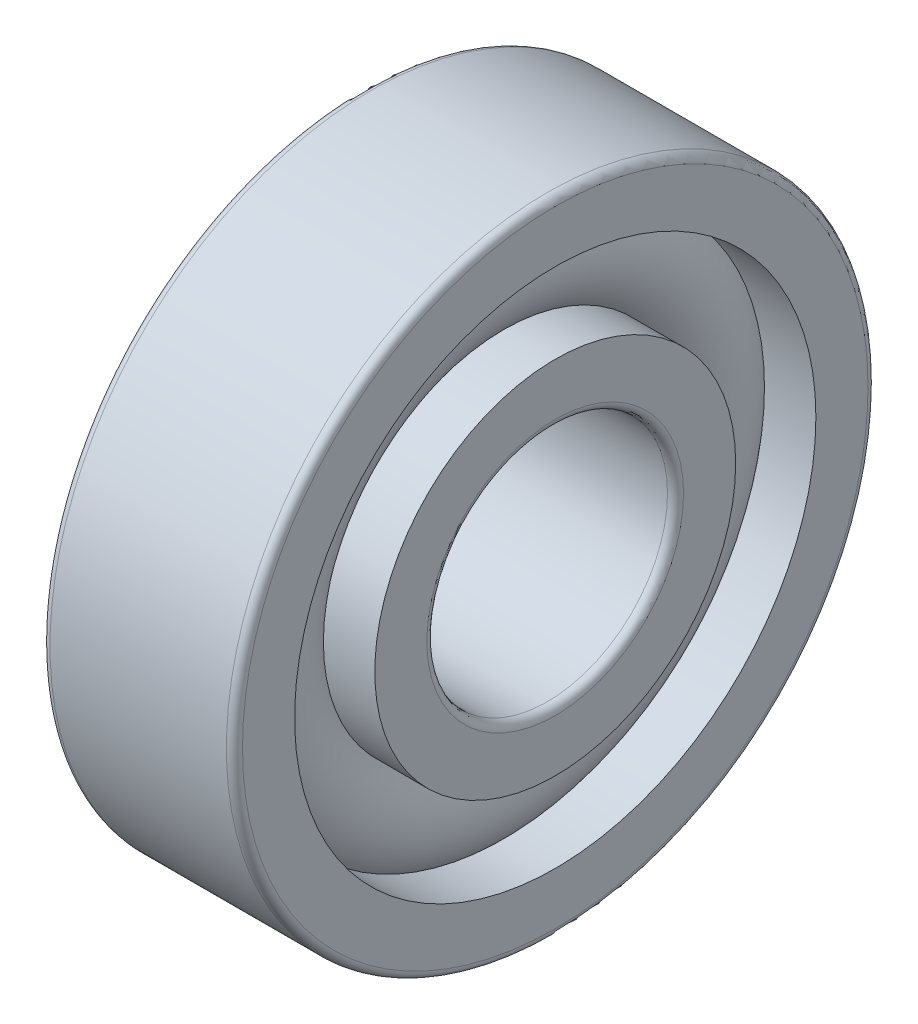
ISO-10303-21;
HEADER;
FILE_DESCRIPTION(('STEP AP214'),'2;1');
FILE_NAME('part.step','',(''),(''),'','','');
FILE_SCHEMA(('AUTOMOTIVE_DESIGN { 1 0 10303 214 1 1 1 1 }'));
ENDSEC;
DATA;
#1=APPLICATION_CONTEXT('core data for automotive mechanical design processes');
#2=APPLICATION_PROTOCOL_DEFINITION('international standard','automotive_design',2000,#1);
#3=PRODUCT_CONTEXT('',#1,'mechanical');
#4=PRODUCT('Part','Part','',(#3));
#5=PRODUCT_RELATED_PRODUCT_CATEGORY('part','',(#4));
#6=PRODUCT_DEFINITION_FORMATION('','',#4);
#7=PRODUCT_DEFINITION_CONTEXT('part definition',#1,'design');
#8=PRODUCT_DEFINITION('design','',#6,#7);
#9=PRODUCT_DEFINITION_SHAPE('','',#8);
#10=(LENGTH_UNIT() NAMED_UNIT(*) SI_UNIT(.MILLI.,.METRE.));
#11=(NAMED_UNIT(*) PLANE_ANGLE_UNIT() SI_UNIT($,.RADIAN.));
#12=(NAMED_UNIT(*) SI_UNIT($,.STERADIAN.) SOLID_ANGLE_UNIT());
#13=UNCERTAINTY_MEASURE_WITH_UNIT(LENGTH_MEASURE(1.E-05),#10,'distance_accuracy_value','');
#14=(GEOMETRIC_REPRESENTATION_CONTEXT(3) GLOBAL_UNCERTAINTY_ASSIGNED_CONTEXT((#13)) GLOBAL_UNIT_ASSIGNED_CONTEXT((#10,
#11,#12)) REPRESENTATION_CONTEXT('',''));
#15=CARTESIAN_POINT('',(0.,0.,0.));
#16=DIRECTION('',(0.,0.,1.));
#17=DIRECTION('',(1.,0.,0.));
#18=AXIS2_PLACEMENT_3D('',#15,#16,#17);
#19=CARTESIAN_POINT('',(0.,0.,0.));
#20=DIRECTION('',(-1.,0.,0.));
#21=DIRECTION('',(0.,0.,1.));
#22=AXIS2_PLACEMENT_3D('',#19,#20,#21);
#23=TOROIDAL_SURFACE('',#22,1.375,0.375);
#24=CARTESIAN_POINT('',(0.279508497187469,0.,0.));
#25=DIRECTION('',(-1.,0.,0.));
#26=DIRECTION('',(0.,0.,1.));
#27=AXIS2_PLACEMENT_3D('',#24,#25,#26);
#28=CIRCLE('',#27,1.625);
#29=CARTESIAN_POINT('',(0.279508497187469,0.,1.625));
#30=VERTEX_POINT('',#29);
#31=EDGE_CURVE('E41',#30,#30,#28,.F.);
#32=ORIENTED_EDGE('',*,*,#31,.T.);
#33=EDGE_LOOP('',(#32));
#34=FACE_BOUND('',#33,.T.);
#35=CARTESIAN_POINT('',(0.279508497187474,0.,0.));
#36=DIRECTION('',(-1.,0.,0.));
#37=DIRECTION('',(0.,0.,1.));
#38=AXIS2_PLACEMENT_3D('',#35,#36,#37);
#39=CIRCLE('',#38,1.125);
#40=CARTESIAN_POINT('',(0.279508497187474,0.,1.125));
#41=VERTEX_POINT('',#40);
#42=EDGE_CURVE('E10',#41,#41,#39,.T.);
#43=ORIENTED_EDGE('',*,*,#42,.T.);
#44=EDGE_LOOP('',(#43));
#45=FACE_BOUND('',#44,.T.);
#46=ADVANCED_FACE('F37',(#34,#45),#23,.T.);
#47=CARTESIAN_POINT('',(-20.6375,0.,0.));
#48=DIRECTION('',(1.,0.,0.));
#49=DIRECTION('',(0.,0.,-1.));
#50=AXIS2_PLACEMENT_3D('',#47,#48,#49);
#51=CYLINDRICAL_SURFACE('',#50,1.125);
#52=CARTESIAN_POINT('',(0.6,0.,0.));
#53=DIRECTION('',(1.,0.,0.));
#54=DIRECTION('',(0.,0.,-1.));
#55=AXIS2_PLACEMENT_3D('',#52,#53,#54);
#56=CIRCLE('',#55,1.125);
#57=CARTESIAN_POINT('',(0.6,0.,-1.125));
#58=VERTEX_POINT('',#57);
#59=EDGE_CURVE('E50',#58,#58,#56,.T.);
#60=ORIENTED_EDGE('',*,*,#59,.F.);
#61=EDGE_LOOP('',(#60));
#62=FACE_BOUND('',#61,.T.);
#63=ORIENTED_EDGE('',*,*,#42,.F.);
#64=EDGE_LOOP('',(#63));
#65=FACE_BOUND('',#64,.T.);
#66=ADVANCED_FACE('F89',(#62,#65),#51,.T.);
#67=CARTESIAN_POINT('',(-20.6375,0.,0.));
#68=DIRECTION('',(1.,0.,0.));
#69=DIRECTION('',(0.,0.,-1.));
#70=AXIS2_PLACEMENT_3D('',#67,#68,#69);
#71=CYLINDRICAL_SURFACE('',#70,1.125);
#72=CARTESIAN_POINT('',(-0.6,0.,0.));
#73=DIRECTION('',(1.,0.,0.));
#74=DIRECTION('',(0.,0.,-1.));
#75=AXIS2_PLACEMENT_3D('',#72,#73,#74);
#76=CIRCLE('',#75,1.125);
#77=CARTESIAN_POINT('',(-0.6,0.,-1.125));
#78=VERTEX_POINT('',#77);
#79=EDGE_CURVE('E59',#78,#78,#76,.T.);
#80=ORIENTED_EDGE('',*,*,#79,.T.);
#81=EDGE_LOOP('',(#80));
#82=FACE_BOUND('',#81,.T.);
#83=CARTESIAN_POINT('',(-0.279508497187474,0.,0.));
#84=DIRECTION('',(1.,0.,0.));
#85=DIRECTION('',(0.,0.,-1.));
#86=AXIS2_PLACEMENT_3D('',#83,#84,#85);
#87=CIRCLE('',#86,1.125);
#88=CARTESIAN_POINT('',(-0.279508497187474,0.,-1.125));
#89=VERTEX_POINT('',#88);
#90=EDGE_CURVE('E45',#89,#89,#87,.T.);
#91=ORIENTED_EDGE('',*,*,#90,.F.);
#92=EDGE_LOOP('',(#91));
#93=FACE_BOUND('',#92,.T.);
#94=ADVANCED_FACE('F92',(#82,#93),#71,.T.);
#95=CARTESIAN_POINT('',(0.6,0.8,0.));
#96=DIRECTION('',(1.,0.,0.));
#97=DIRECTION('',(0.,0.,-1.));
#98=AXIS2_PLACEMENT_3D('',#95,#96,#97);
#99=PLANE('',#98);
#100=ORIENTED_EDGE('',*,*,#59,.T.);
#101=EDGE_LOOP('',(#100));
#102=FACE_BOUND('',#101,.T.);
#103=CARTESIAN_POINT('',(0.6,0.,0.));
#104=DIRECTION('',(1.,0.,0.));
#105=DIRECTION('',(0.,0.,-1.));
#106=AXIS2_PLACEMENT_3D('',#103,#104,#105);
#107=CIRCLE('',#106,0.8);
#108=CARTESIAN_POINT('',(0.6,0.,-0.8));
#109=VERTEX_POINT('',#108);
#110=EDGE_CURVE('E81',#109,#109,#107,.T.);
#111=ORIENTED_EDGE('',*,*,#110,.F.);
#112=EDGE_LOOP('',(#111));
#113=FACE_BOUND('',#112,.T.);
#114=ADVANCED_FACE('F86',(#102,#113),#99,.T.);
#115=CARTESIAN_POINT('',(0.55,0.,0.));
#116=DIRECTION('',(1.,0.,0.));
#117=DIRECTION('',(0.,0.,-1.));
#118=AXIS2_PLACEMENT_3D('',#115,#116,#117);
#119=TOROIDAL_SURFACE('',#118,0.8,0.05);
#120=ORIENTED_EDGE('',*,*,#110,.T.);
#121=EDGE_LOOP('',(#120));
#122=FACE_BOUND('',#121,.T.);
#123=CARTESIAN_POINT('',(0.549999999999998,0.,0.));
#124=DIRECTION('',(1.,0.,0.));
#125=DIRECTION('',(0.,0.,-1.));
#126=AXIS2_PLACEMENT_3D('',#123,#124,#125);
#127=CIRCLE('',#126,0.75);
#128=CARTESIAN_POINT('',(0.549999999999998,0.,-0.75));
#129=VERTEX_POINT('',#128);
#130=EDGE_CURVE('E78',#129,#129,#127,.T.);
#131=ORIENTED_EDGE('',*,*,#130,.F.);
#132=EDGE_LOOP('',(#131));
#133=FACE_BOUND('',#132,.T.);
#134=ADVANCED_FACE('F103',(#122,#133),#119,.T.);
#135=CARTESIAN_POINT('',(-20.6375,0.,0.));
#136=DIRECTION('',(1.,0.,0.));
#137=DIRECTION('',(0.,0.,-1.));
#138=AXIS2_PLACEMENT_3D('',#135,#136,#137);
#139=CYLINDRICAL_SURFACE('',#138,0.75);
#140=ORIENTED_EDGE('',*,*,#130,.T.);
#141=EDGE_LOOP('',(#140));
#142=FACE_BOUND('',#141,.T.);
#143=CARTESIAN_POINT('',(-0.549999999999998,0.,0.));
#144=DIRECTION('',(1.,0.,0.));
#145=DIRECTION('',(0.,0.,-1.));
#146=AXIS2_PLACEMENT_3D('',#143,#144,#145);
#147=CIRCLE('',#146,0.75);
#148=CARTESIAN_POINT('',(-0.549999999999998,0.,-0.75));
#149=VERTEX_POINT('',#148);
#150=EDGE_CURVE('E75',#149,#149,#147,.T.);
#151=ORIENTED_EDGE('',*,*,#150,.F.);
#152=EDGE_LOOP('',(#151));
#153=FACE_BOUND('',#152,.T.);
#154=ADVANCED_FACE('F106',(#142,#153),#139,.F.);
#155=CARTESIAN_POINT('',(-0.55,0.,0.));
#156=DIRECTION('',(1.,0.,0.));
#157=DIRECTION('',(0.,0.,-1.));
#158=AXIS2_PLACEMENT_3D('',#155,#156,#157);
#159=TOROIDAL_SURFACE('',#158,0.8,0.05);
#160=ORIENTED_EDGE('',*,*,#150,.T.);
#161=EDGE_LOOP('',(#160));
#162=FACE_BOUND('',#161,.T.);
#163=CARTESIAN_POINT('',(-0.6,0.,0.));
#164=DIRECTION('',(1.,0.,0.));
#165=DIRECTION('',(0.,0.,-1.));
#166=AXIS2_PLACEMENT_3D('',#163,#164,#165);
#167=CIRCLE('',#166,0.8);
#168=CARTESIAN_POINT('',(-0.6,0.,-0.8));
#169=VERTEX_POINT('',#168);
#170=EDGE_CURVE('E72',#169,#169,#167,.T.);
#171=ORIENTED_EDGE('',*,*,#170,.F.);
#172=EDGE_LOOP('',(#171));
#173=FACE_BOUND('',#172,.T.);
#174=ADVANCED_FACE('F110',(#162,#173),#159,.T.);
#175=CARTESIAN_POINT('',(-0.6,1.125,0.));
#176=DIRECTION('',(-1.,0.,0.));
#177=DIRECTION('',(0.,0.,1.));
#178=AXIS2_PLACEMENT_3D('',#175,#176,#177);
#179=PLANE('',#178);
#180=ORIENTED_EDGE('',*,*,#170,.T.);
#181=EDGE_LOOP('',(#180));
#182=FACE_BOUND('',#181,.T.);
#183=ORIENTED_EDGE('',*,*,#79,.F.);
#184=EDGE_LOOP('',(#183));
#185=FACE_BOUND('',#184,.T.);
#186=ADVANCED_FACE('F114',(#182,#185),#179,.T.);
#187=CARTESIAN_POINT('',(-0.279508497187469,0.,0.));
#188=DIRECTION('',(1.,0.,0.));
#189=DIRECTION('',(0.,0.,-1.));
#190=AXIS2_PLACEMENT_3D('',#187,#188,#189);
#191=CIRCLE('',#190,1.625);
#192=CARTESIAN_POINT('',(-0.279508497187469,0.,-1.625));
#193=VERTEX_POINT('',#192);
#194=EDGE_CURVE('E53',#193,#193,#191,.F.);
#195=ORIENTED_EDGE('',*,*,#194,.T.);
#196=EDGE_LOOP('',(#195));
#197=FACE_BOUND('',#196,.T.);
#198=ORIENTED_EDGE('',*,*,#90,.T.);
#199=EDGE_LOOP('',(#198));
#200=FACE_BOUND('',#199,.T.);
#201=ADVANCED_FACE('F39',(#197,#200),#23,.T.);
#202=CARTESIAN_POINT('',(-20.6375,0.,0.));
#203=DIRECTION('',(1.,0.,0.));
#204=DIRECTION('',(0.,0.,-1.));
#205=AXIS2_PLACEMENT_3D('',#202,#203,#204);
#206=CYLINDRICAL_SURFACE('',#205,1.625);
#207=CARTESIAN_POINT('',(0.6,0.,0.));
#208=DIRECTION('',(1.,0.,0.));
#209=DIRECTION('',(0.,0.,-1.));
#210=AXIS2_PLACEMENT_3D('',#207,#208,#209);
#211=CIRCLE('',#210,1.625);
#212=CARTESIAN_POINT('',(0.6,0.,-1.625));
#213=VERTEX_POINT('',#212);
#214=EDGE_CURVE('E55',#213,#213,#211,.T.);
#215=ORIENTED_EDGE('',*,*,#214,.T.);
#216=EDGE_LOOP('',(#215));
#217=FACE_BOUND('',#216,.T.);
#218=ORIENTED_EDGE('',*,*,#31,.F.);
#219=EDGE_LOOP('',(#218));
#220=FACE_BOUND('',#219,.T.);
#221=ADVANCED_FACE('F119',(#217,#220),#206,.F.);
#222=CARTESIAN_POINT('',(-20.6375,0.,0.));
#223=DIRECTION('',(1.,0.,0.));
#224=DIRECTION('',(0.,0.,-1.));
#225=AXIS2_PLACEMENT_3D('',#222,#223,#224);
#226=CYLINDRICAL_SURFACE('',#225,1.625);
#227=CARTESIAN_POINT('',(-0.6,0.,0.));
#228=DIRECTION('',(1.,0.,0.));
#229=DIRECTION('',(0.,0.,-1.));
#230=AXIS2_PLACEMENT_3D('',#227,#228,#229);
#231=CIRCLE('',#230,1.625);
#232=CARTESIAN_POINT('',(-0.6,0.,-1.625));
#233=VERTEX_POINT('',#232);
#234=EDGE_CURVE('E150',#233,#233,#231,.T.);
#235=ORIENTED_EDGE('',*,*,#234,.F.);
#236=EDGE_LOOP('',(#235));
#237=FACE_BOUND('',#236,.T.);
#238=ORIENTED_EDGE('',*,*,#194,.F.);
#239=EDGE_LOOP('',(#238));
#240=FACE_BOUND('',#239,.T.);
#241=ADVANCED_FACE('F122',(#237,#240),#226,.F.);
#242=CARTESIAN_POINT('',(0.6,1.95000000000001,0.));
#243=DIRECTION('',(1.,0.,0.));
#244=DIRECTION('',(0.,0.,-1.));
#245=AXIS2_PLACEMENT_3D('',#242,#243,#244);
#246=PLANE('',#245);
#247=CARTESIAN_POINT('',(0.6,0.,0.));
#248=DIRECTION('',(1.,0.,0.));
#249=DIRECTION('',(0.,0.,-1.));
#250=AXIS2_PLACEMENT_3D('',#247,#248,#249);
#251=CIRCLE('',#250,1.95000000000001);
#252=CARTESIAN_POINT('',(0.6,0.,-1.95000000000001));
#253=VERTEX_POINT('',#252);
#254=EDGE_CURVE('E61',#253,#253,#251,.T.);
#255=ORIENTED_EDGE('',*,*,#254,.T.);
#256=EDGE_LOOP('',(#255));
#257=FACE_BOUND('',#256,.T.);
#258=ORIENTED_EDGE('',*,*,#214,.F.);
#259=EDGE_LOOP('',(#258));
#260=FACE_BOUND('',#259,.T.);
#261=ADVANCED_FACE('F123',(#257,#260),#246,.T.);
#262=CARTESIAN_POINT('',(0.55,0.,0.));
#263=DIRECTION('',(1.,0.,0.));
#264=DIRECTION('',(0.,0.,-1.));
#265=AXIS2_PLACEMENT_3D('',#262,#263,#264);
#266=TOROIDAL_SURFACE('',#265,1.95000000000001,0.0500000000000001);
#267=CARTESIAN_POINT('',(0.549999999999998,0.,0.));
#268=DIRECTION('',(1.,0.,0.));
#269=DIRECTION('',(0.,0.,-1.));
#270=AXIS2_PLACEMENT_3D('',#267,#268,#269);
#271=CIRCLE('',#270,2.00000000000001);
#272=CARTESIAN_POINT('',(0.549999999999998,0.,-2.00000000000001));
#273=VERTEX_POINT('',#272);
#274=EDGE_CURVE('E66',#273,#273,#271,.T.);
#275=ORIENTED_EDGE('',*,*,#274,.T.);
#276=EDGE_LOOP('',(#275));
#277=FACE_BOUND('',#276,.T.);
#278=ORIENTED_EDGE('',*,*,#254,.F.);
#279=EDGE_LOOP('',(#278));
#280=FACE_BOUND('',#279,.T.);
#281=ADVANCED_FACE('F126',(#277,#280),#266,.T.);
#282=CARTESIAN_POINT('',(-20.6375,0.,0.));
#283=DIRECTION('',(1.,0.,0.));
#284=DIRECTION('',(0.,0.,-1.));
#285=AXIS2_PLACEMENT_3D('',#282,#283,#284);
#286=CYLINDRICAL_SURFACE('',#285,2.00000000000001);
#287=CARTESIAN_POINT('',(-0.549999999999998,0.,0.));
#288=DIRECTION('',(1.,0.,0.));
#289=DIRECTION('',(0.,0.,-1.));
#290=AXIS2_PLACEMENT_3D('',#287,#288,#289);
#291=CIRCLE('',#290,2.00000000000001);
#292=CARTESIAN_POINT('',(-0.549999999999998,0.,-2.00000000000001));
#293=VERTEX_POINT('',#292);
#294=EDGE_CURVE('E154',#293,#293,#291,.T.);
#295=ORIENTED_EDGE('',*,*,#294,.T.);
#296=EDGE_LOOP('',(#295));
#297=FACE_BOUND('',#296,.T.);
#298=ORIENTED_EDGE('',*,*,#274,.F.);
#299=EDGE_LOOP('',(#298));
#300=FACE_BOUND('',#299,.T.);
#301=ADVANCED_FACE('F130',(#297,#300),#286,.T.);
#302=CARTESIAN_POINT('',(-0.55,0.,0.));
#303=DIRECTION('',(1.,0.,0.));
#304=DIRECTION('',(0.,0.,-1.));
#305=AXIS2_PLACEMENT_3D('',#302,#303,#304);
#306=TOROIDAL_SURFACE('',#305,1.95000000000001,0.0500000000000001);
#307=CARTESIAN_POINT('',(-0.6,0.,0.));
#308=DIRECTION('',(1.,0.,0.));
#309=DIRECTION('',(0.,0.,-1.));
#310=AXIS2_PLACEMENT_3D('',#307,#308,#309);
#311=CIRCLE('',#310,1.95000000000001);
#312=CARTESIAN_POINT('',(-0.6,0.,-1.95000000000001));
#313=VERTEX_POINT('',#312);
#314=EDGE_CURVE('E151',#313,#313,#311,.T.);
#315=ORIENTED_EDGE('',*,*,#314,.T.);
#316=EDGE_LOOP('',(#315));
#317=FACE_BOUND('',#316,.T.);
#318=ORIENTED_EDGE('',*,*,#294,.F.);
#319=EDGE_LOOP('',(#318));
#320=FACE_BOUND('',#319,.T.);
#321=ADVANCED_FACE('F134',(#317,#320),#306,.T.);
#322=CARTESIAN_POINT('',(-0.6,1.625,0.));
#323=DIRECTION('',(-1.,0.,0.));
#324=DIRECTION('',(0.,0.,1.));
#325=AXIS2_PLACEMENT_3D('',#322,#323,#324);
#326=PLANE('',#325);
#327=ORIENTED_EDGE('',*,*,#234,.T.);
#328=EDGE_LOOP('',(#327));
#329=FACE_BOUND('',#328,.T.);
#330=ORIENTED_EDGE('',*,*,#314,.F.);
#331=EDGE_LOOP('',(#330));
#332=FACE_BOUND('',#331,.T.);
#333=ADVANCED_FACE('F138',(#329,#332),#326,.T.);
#334=CLOSED_SHELL('',(#46,#66,#94,#114,#134,#154,#174,#186,#201,#221,#241,#261,#281,#301,#321,#333));
#335=MANIFOLD_SOLID_BREP('B2',#334);
#336=ADVANCED_BREP_SHAPE_REPRESENTATION('',(#18,#335),#14);
#337=SHAPE_DEFINITION_REPRESENTATION(#9,#336);
ENDSEC;
END-ISO-10303-21;
